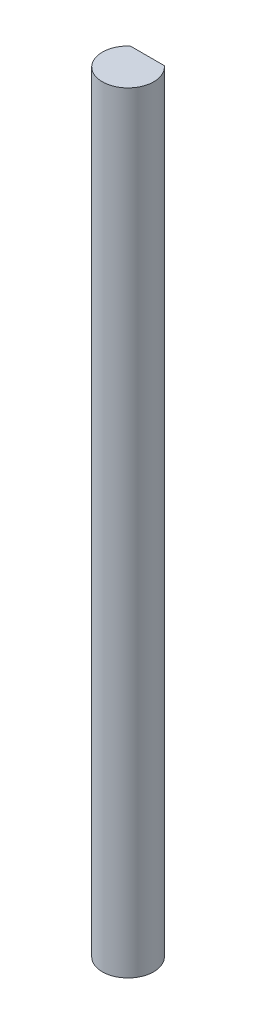
ISO-10303-21;
HEADER;
FILE_DESCRIPTION(('STEP AP214'),'2;1');
FILE_NAME('part.step','',(''),(''),'','','');
FILE_SCHEMA(('AUTOMOTIVE_DESIGN { 1 0 10303 214 1 1 1 1 }'));
ENDSEC;
DATA;
#1=APPLICATION_CONTEXT('core data for automotive mechanical design processes');
#2=APPLICATION_PROTOCOL_DEFINITION('international standard','automotive_design',2000,#1);
#3=PRODUCT_CONTEXT('',#1,'mechanical');
#4=PRODUCT('Part','Part','',(#3));
#5=PRODUCT_RELATED_PRODUCT_CATEGORY('part','',(#4));
#6=PRODUCT_DEFINITION_FORMATION('','',#4);
#7=PRODUCT_DEFINITION_CONTEXT('part definition',#1,'design');
#8=PRODUCT_DEFINITION('design','',#6,#7);
#9=PRODUCT_DEFINITION_SHAPE('','',#8);
#10=(LENGTH_UNIT() NAMED_UNIT(*) SI_UNIT(.MILLI.,.METRE.));
#11=(NAMED_UNIT(*) PLANE_ANGLE_UNIT() SI_UNIT($,.RADIAN.));
#12=(NAMED_UNIT(*) SI_UNIT($,.STERADIAN.) SOLID_ANGLE_UNIT());
#13=UNCERTAINTY_MEASURE_WITH_UNIT(LENGTH_MEASURE(1.E-05),#10,'distance_accuracy_value','');
#14=(GEOMETRIC_REPRESENTATION_CONTEXT(3) GLOBAL_UNCERTAINTY_ASSIGNED_CONTEXT((#13)) GLOBAL_UNIT_ASSIGNED_CONTEXT((#10,
#11,#12)) REPRESENTATION_CONTEXT('',''));
#15=CARTESIAN_POINT('',(0.,0.,0.));
#16=DIRECTION('',(0.,0.,1.));
#17=DIRECTION('',(1.,0.,0.));
#18=AXIS2_PLACEMENT_3D('',#15,#16,#17);
#19=CARTESIAN_POINT('',(0.,60.,0.));
#20=DIRECTION('',(0.,-1.,0.));
#21=DIRECTION('',(0.,0.,-1.));
#22=AXIS2_PLACEMENT_3D('',#19,#20,#21);
#23=CYLINDRICAL_SURFACE('',#22,2.);
#24=CARTESIAN_POINT('',(0.,60.,0.));
#25=DIRECTION('',(0.,1.,0.));
#26=DIRECTION('',(0.,0.,1.));
#27=AXIS2_PLACEMENT_3D('',#24,#25,#26);
#28=CIRCLE('',#27,2.);
#29=CARTESIAN_POINT('',(-1.3228756555323,60.,-1.5));
#30=VERTEX_POINT('',#29);
#31=CARTESIAN_POINT('',(1.3228756555323,60.,-1.5));
#32=VERTEX_POINT('',#31);
#33=EDGE_CURVE('E11',#30,#32,#28,.T.);
#34=ORIENTED_EDGE('',*,*,#33,.F.);
#35=DIRECTION('',(0.,1.,0.));
#36=VECTOR('',#35,1.);
#37=CARTESIAN_POINT('',(-1.3228756555323,48.,-1.5));
#38=LINE('',#37,#36);
#39=CARTESIAN_POINT('',(-1.3228756555323,48.,-1.5));
#40=VERTEX_POINT('',#39);
#41=EDGE_CURVE('E61',#40,#30,#38,.T.);
#42=ORIENTED_EDGE('',*,*,#41,.F.);
#43=CARTESIAN_POINT('',(0.,48.,0.));
#44=DIRECTION('',(0.,1.,0.));
#45=DIRECTION('',(0.,0.,1.));
#46=AXIS2_PLACEMENT_3D('',#43,#44,#45);
#47=CIRCLE('',#46,2.);
#48=CARTESIAN_POINT('',(1.3228756555323,48.,-1.5));
#49=VERTEX_POINT('',#48);
#50=EDGE_CURVE('E94',#49,#40,#47,.T.);
#51=ORIENTED_EDGE('',*,*,#50,.F.);
#52=DIRECTION('',(0.,1.,0.));
#53=VECTOR('',#52,1.);
#54=CARTESIAN_POINT('',(1.3228756555323,48.,-1.5));
#55=LINE('',#54,#53);
#56=EDGE_CURVE('E90',#49,#32,#55,.T.);
#57=ORIENTED_EDGE('',*,*,#56,.T.);
#58=EDGE_LOOP('',(#34,#42,#51,#57));
#59=FACE_BOUND('',#58,.T.);
#60=DIRECTION('',(0.,-1.,0.));
#61=VECTOR('',#60,1.);
#62=CARTESIAN_POINT('',(1.3228756555323,12.,-1.5));
#63=LINE('',#62,#61);
#64=CARTESIAN_POINT('',(1.3228756555323,12.,-1.5));
#65=VERTEX_POINT('',#64);
#66=CARTESIAN_POINT('',(1.3228756555323,0.,-1.5));
#67=VERTEX_POINT('',#66);
#68=EDGE_CURVE('E69',#65,#67,#63,.T.);
#69=ORIENTED_EDGE('',*,*,#68,.F.);
#70=CARTESIAN_POINT('',(0.,12.,0.));
#71=DIRECTION('',(0.,1.,0.));
#72=DIRECTION('',(0.,0.,1.));
#73=AXIS2_PLACEMENT_3D('',#70,#71,#72);
#74=CIRCLE('',#73,2.);
#75=CARTESIAN_POINT('',(-1.3228756555323,12.,-1.5));
#76=VERTEX_POINT('',#75);
#77=EDGE_CURVE('E115',#65,#76,#74,.T.);
#78=ORIENTED_EDGE('',*,*,#77,.T.);
#79=DIRECTION('',(0.,-1.,0.));
#80=VECTOR('',#79,1.);
#81=CARTESIAN_POINT('',(-1.3228756555323,12.,-1.5));
#82=LINE('',#81,#80);
#83=CARTESIAN_POINT('',(-1.3228756555323,0.,-1.5));
#84=VERTEX_POINT('',#83);
#85=EDGE_CURVE('E118',#76,#84,#82,.T.);
#86=ORIENTED_EDGE('',*,*,#85,.T.);
#87=CARTESIAN_POINT('',(0.,0.,0.));
#88=DIRECTION('',(0.,1.,0.));
#89=DIRECTION('',(0.,0.,1.));
#90=AXIS2_PLACEMENT_3D('',#87,#88,#89);
#91=CIRCLE('',#90,2.);
#92=EDGE_CURVE('E49',#84,#67,#91,.T.);
#93=ORIENTED_EDGE('',*,*,#92,.T.);
#94=EDGE_LOOP('',(#69,#78,#86,#93));
#95=FACE_BOUND('',#94,.T.);
#96=ADVANCED_FACE('F46',(#59,#95),#23,.T.);
#97=CARTESIAN_POINT('',(0.,0.,0.));
#98=DIRECTION('',(0.,1.,0.));
#99=DIRECTION('',(0.,0.,1.));
#100=AXIS2_PLACEMENT_3D('',#97,#98,#99);
#101=PLANE('',#100);
#102=DIRECTION('',(1.,0.,0.));
#103=VECTOR('',#102,1.);
#104=CARTESIAN_POINT('',(0.,0.,-1.5));
#105=LINE('',#104,#103);
#106=EDGE_CURVE('E104',#84,#67,#105,.T.);
#107=ORIENTED_EDGE('',*,*,#106,.T.);
#108=ORIENTED_EDGE('',*,*,#92,.F.);
#109=EDGE_LOOP('',(#107,#108));
#110=FACE_BOUND('',#109,.T.);
#111=ADVANCED_FACE('F128',(#110),#101,.F.);
#112=CARTESIAN_POINT('',(0.,60.,0.));
#113=DIRECTION('',(0.,1.,0.));
#114=DIRECTION('',(0.,0.,1.));
#115=AXIS2_PLACEMENT_3D('',#112,#113,#114);
#116=PLANE('',#115);
#117=DIRECTION('',(1.,0.,0.));
#118=VECTOR('',#117,1.);
#119=CARTESIAN_POINT('',(0.,60.,-1.5));
#120=LINE('',#119,#118);
#121=EDGE_CURVE('E95',#30,#32,#120,.T.);
#122=ORIENTED_EDGE('',*,*,#121,.F.);
#123=ORIENTED_EDGE('',*,*,#33,.T.);
#124=EDGE_LOOP('',(#122,#123));
#125=FACE_BOUND('',#124,.T.);
#126=ADVANCED_FACE('F141',(#125),#116,.T.);
#127=CARTESIAN_POINT('',(0.,12.,-1.5));
#128=DIRECTION('',(0.,0.,-1.));
#129=DIRECTION('',(-1.,0.,0.));
#130=AXIS2_PLACEMENT_3D('',#127,#128,#129);
#131=PLANE('',#130);
#132=ORIENTED_EDGE('',*,*,#106,.F.);
#133=ORIENTED_EDGE('',*,*,#85,.F.);
#134=DIRECTION('',(1.,0.,0.));
#135=VECTOR('',#134,1.);
#136=CARTESIAN_POINT('',(0.,12.,-1.5));
#137=LINE('',#136,#135);
#138=EDGE_CURVE('E108',#76,#65,#137,.T.);
#139=ORIENTED_EDGE('',*,*,#138,.T.);
#140=ORIENTED_EDGE('',*,*,#68,.T.);
#141=EDGE_LOOP('',(#132,#133,#139,#140));
#142=FACE_BOUND('',#141,.T.);
#143=ADVANCED_FACE('F129',(#142),#131,.T.);
#144=CARTESIAN_POINT('',(0.,12.,0.));
#145=DIRECTION('',(0.,1.,0.));
#146=DIRECTION('',(0.,0.,1.));
#147=AXIS2_PLACEMENT_3D('',#144,#145,#146);
#148=PLANE('',#147);
#149=ORIENTED_EDGE('',*,*,#138,.F.);
#150=ORIENTED_EDGE('',*,*,#77,.F.);
#151=EDGE_LOOP('',(#149,#150));
#152=FACE_BOUND('',#151,.T.);
#153=ADVANCED_FACE('F132',(#152),#148,.F.);
#154=CARTESIAN_POINT('',(0.,48.,-1.5));
#155=DIRECTION('',(0.,0.,1.));
#156=DIRECTION('',(1.,0.,0.));
#157=AXIS2_PLACEMENT_3D('',#154,#155,#156);
#158=PLANE('',#157);
#159=ORIENTED_EDGE('',*,*,#121,.T.);
#160=ORIENTED_EDGE('',*,*,#56,.F.);
#161=DIRECTION('',(1.,0.,0.));
#162=VECTOR('',#161,1.);
#163=CARTESIAN_POINT('',(0.,48.,-1.5));
#164=LINE('',#163,#162);
#165=EDGE_CURVE('E86',#40,#49,#164,.T.);
#166=ORIENTED_EDGE('',*,*,#165,.F.);
#167=ORIENTED_EDGE('',*,*,#41,.T.);
#168=EDGE_LOOP('',(#159,#160,#166,#167));
#169=FACE_BOUND('',#168,.T.);
#170=ADVANCED_FACE('F88',(#169),#158,.F.);
#171=CARTESIAN_POINT('',(0.,48.,0.));
#172=DIRECTION('',(0.,-1.,0.));
#173=DIRECTION('',(0.,0.,1.));
#174=AXIS2_PLACEMENT_3D('',#171,#172,#173);
#175=PLANE('',#174);
#176=ORIENTED_EDGE('',*,*,#165,.T.);
#177=ORIENTED_EDGE('',*,*,#50,.T.);
#178=EDGE_LOOP('',(#176,#177));
#179=FACE_BOUND('',#178,.T.);
#180=ADVANCED_FACE('F97',(#179),#175,.F.);
#181=CLOSED_SHELL('',(#96,#111,#126,#143,#153,#170,#180));
#182=MANIFOLD_SOLID_BREP('B2',#181);
#183=ADVANCED_BREP_SHAPE_REPRESENTATION('',(#18,#182),#14);
#184=SHAPE_DEFINITION_REPRESENTATION(#9,#183);
ENDSEC;
END-ISO-10303-21;
